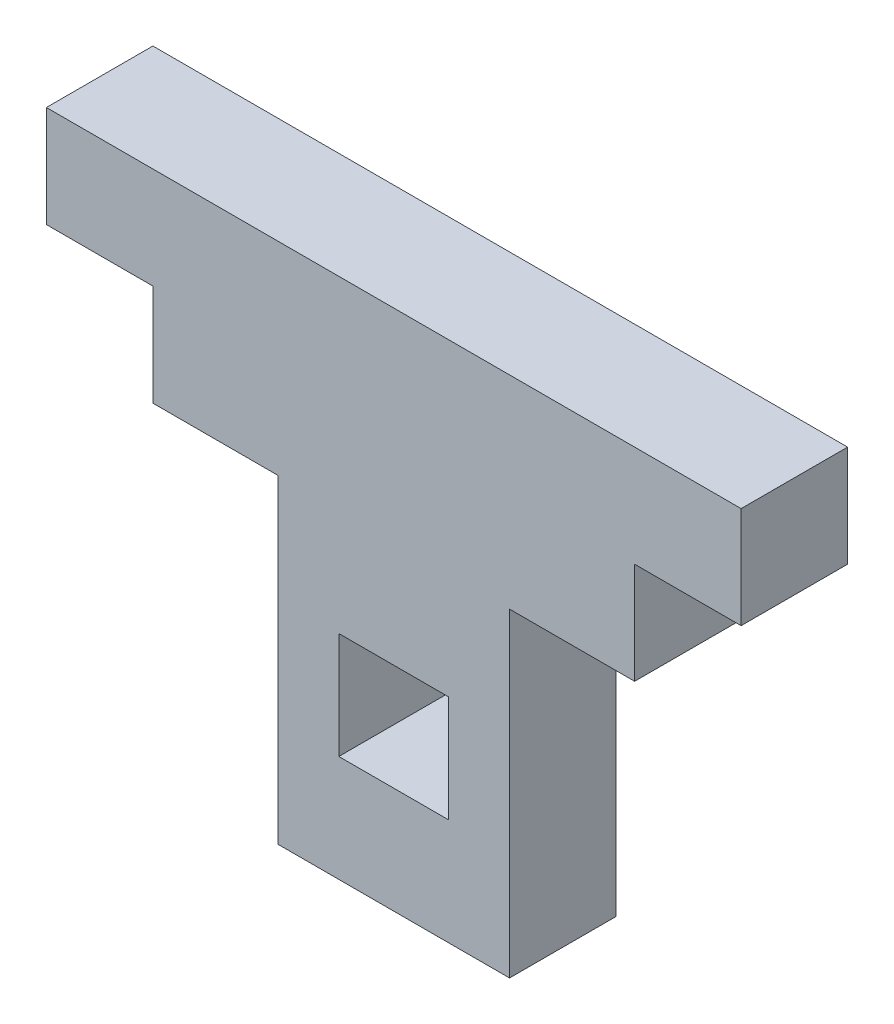
ISO-10303-21;
HEADER;
FILE_DESCRIPTION(('STEP AP214'),'2;1');
FILE_NAME('part.step','',(''),(''),'','','');
FILE_SCHEMA(('AUTOMOTIVE_DESIGN { 1 0 10303 214 1 1 1 1 }'));
ENDSEC;
DATA;
#1=APPLICATION_CONTEXT('core data for automotive mechanical design processes');
#2=APPLICATION_PROTOCOL_DEFINITION('international standard','automotive_design',2000,#1);
#3=PRODUCT_CONTEXT('',#1,'mechanical');
#4=PRODUCT('Part','Part','',(#3));
#5=PRODUCT_RELATED_PRODUCT_CATEGORY('part','',(#4));
#6=PRODUCT_DEFINITION_FORMATION('','',#4);
#7=PRODUCT_DEFINITION_CONTEXT('part definition',#1,'design');
#8=PRODUCT_DEFINITION('design','',#6,#7);
#9=PRODUCT_DEFINITION_SHAPE('','',#8);
#10=(LENGTH_UNIT() NAMED_UNIT(*) SI_UNIT(.MILLI.,.METRE.));
#11=(NAMED_UNIT(*) PLANE_ANGLE_UNIT() SI_UNIT($,.RADIAN.));
#12=(NAMED_UNIT(*) SI_UNIT($,.STERADIAN.) SOLID_ANGLE_UNIT());
#13=UNCERTAINTY_MEASURE_WITH_UNIT(LENGTH_MEASURE(1.E-05),#10,'distance_accuracy_value','');
#14=(GEOMETRIC_REPRESENTATION_CONTEXT(3) GLOBAL_UNCERTAINTY_ASSIGNED_CONTEXT((#13)) GLOBAL_UNIT_ASSIGNED_CONTEXT((#10,
#11,#12)) REPRESENTATION_CONTEXT('',''));
#15=CARTESIAN_POINT('',(0.,0.,0.));
#16=DIRECTION('',(0.,0.,1.));
#17=DIRECTION('',(1.,0.,0.));
#18=AXIS2_PLACEMENT_3D('',#15,#16,#17);
#19=CARTESIAN_POINT('',(0.,0.,0.));
#20=DIRECTION('',(0.,1.,0.));
#21=DIRECTION('',(0.,0.,1.));
#22=AXIS2_PLACEMENT_3D('',#19,#20,#21);
#23=PLANE('',#22);
#24=DIRECTION('',(0.,0.,1.));
#25=VECTOR('',#24,1.);
#26=CARTESIAN_POINT('',(0.,0.,5.334));
#27=LINE('',#26,#25);
#28=CARTESIAN_POINT('',(0.,0.,0.));
#29=VERTEX_POINT('',#28);
#30=CARTESIAN_POINT('',(0.,0.,5.334));
#31=VERTEX_POINT('',#30);
#32=EDGE_CURVE('E216',#29,#31,#27,.T.);
#33=ORIENTED_EDGE('',*,*,#32,.F.);
#34=DIRECTION('',(1.,0.,0.));
#35=VECTOR('',#34,1.);
#36=CARTESIAN_POINT('',(-5.334,0.,0.));
#37=LINE('',#36,#35);
#38=CARTESIAN_POINT('',(6.26533333333333,0.,0.));
#39=VERTEX_POINT('',#38);
#40=EDGE_CURVE('E178',#29,#39,#37,.T.);
#41=ORIENTED_EDGE('',*,*,#40,.T.);
#42=DIRECTION('',(0.,0.,1.));
#43=VECTOR('',#42,1.);
#44=CARTESIAN_POINT('',(6.26533333333333,0.,0.));
#45=LINE('',#44,#43);
#46=CARTESIAN_POINT('',(6.26533333333333,0.,5.334));
#47=VERTEX_POINT('',#46);
#48=EDGE_CURVE('E269',#39,#47,#45,.T.);
#49=ORIENTED_EDGE('',*,*,#48,.T.);
#50=DIRECTION('',(-1.,0.,0.));
#51=VECTOR('',#50,1.);
#52=CARTESIAN_POINT('',(-5.334,0.,5.334));
#53=LINE('',#52,#51);
#54=EDGE_CURVE('E272',#47,#31,#53,.T.);
#55=ORIENTED_EDGE('',*,*,#54,.T.);
#56=EDGE_LOOP('',(#33,#41,#49,#55));
#57=FACE_BOUND('',#56,.T.);
#58=ADVANCED_FACE('F35',(#57),#23,.F.);
#59=CARTESIAN_POINT('',(29.464,0.,0.));
#60=DIRECTION('',(1.,0.,0.));
#61=DIRECTION('',(0.,1.,0.));
#62=AXIS2_PLACEMENT_3D('',#59,#60,#61);
#63=PLANE('',#62);
#64=DIRECTION('',(0.,0.,1.));
#65=VECTOR('',#64,1.);
#66=CARTESIAN_POINT('',(29.464,5.08000000000001,5.334));
#67=LINE('',#66,#65);
#68=CARTESIAN_POINT('',(29.464,5.08000000000001,0.));
#69=VERTEX_POINT('',#68);
#70=CARTESIAN_POINT('',(29.464,5.08000000000001,5.334));
#71=VERTEX_POINT('',#70);
#72=EDGE_CURVE('E306',#69,#71,#67,.T.);
#73=ORIENTED_EDGE('',*,*,#72,.F.);
#74=DIRECTION('',(0.,1.,0.));
#75=VECTOR('',#74,1.);
#76=CARTESIAN_POINT('',(29.464,10.16,0.));
#77=LINE('',#76,#75);
#78=CARTESIAN_POINT('',(29.464,10.16,0.));
#79=VERTEX_POINT('',#78);
#80=EDGE_CURVE('E189',#69,#79,#77,.T.);
#81=ORIENTED_EDGE('',*,*,#80,.T.);
#82=DIRECTION('',(0.,0.,1.));
#83=VECTOR('',#82,1.);
#84=CARTESIAN_POINT('',(29.464,10.16,5.334));
#85=LINE('',#84,#83);
#86=CARTESIAN_POINT('',(29.464,10.16,5.334));
#87=VERTEX_POINT('',#86);
#88=EDGE_CURVE('E200',#79,#87,#85,.T.);
#89=ORIENTED_EDGE('',*,*,#88,.T.);
#90=DIRECTION('',(0.,-1.,0.));
#91=VECTOR('',#90,1.);
#92=CARTESIAN_POINT('',(29.464,10.16,5.334));
#93=LINE('',#92,#91);
#94=EDGE_CURVE('E186',#87,#71,#93,.T.);
#95=ORIENTED_EDGE('',*,*,#94,.T.);
#96=EDGE_LOOP('',(#73,#81,#89,#95));
#97=FACE_BOUND('',#96,.T.);
#98=ADVANCED_FACE('F305',(#97),#63,.T.);
#99=CARTESIAN_POINT('',(0.,10.16,5.334));
#100=DIRECTION('',(0.,1.,0.));
#101=DIRECTION('',(0.,0.,1.));
#102=AXIS2_PLACEMENT_3D('',#99,#100,#101);
#103=PLANE('',#102);
#104=DIRECTION('',(1.,0.,0.));
#105=VECTOR('',#104,1.);
#106=CARTESIAN_POINT('',(0.,10.16,0.));
#107=LINE('',#106,#105);
#108=CARTESIAN_POINT('',(-5.33400000000001,10.16,0.));
#109=VERTEX_POINT('',#108);
#110=EDGE_CURVE('E39',#109,#79,#107,.T.);
#111=ORIENTED_EDGE('',*,*,#110,.F.);
#112=DIRECTION('',(0.,0.,-1.));
#113=VECTOR('',#112,1.);
#114=CARTESIAN_POINT('',(-5.33400000000001,10.16,0.));
#115=LINE('',#114,#113);
#116=CARTESIAN_POINT('',(-5.33400000000001,10.16,5.334));
#117=VERTEX_POINT('',#116);
#118=EDGE_CURVE('E221',#117,#109,#115,.T.);
#119=ORIENTED_EDGE('',*,*,#118,.F.);
#120=DIRECTION('',(1.,0.,0.));
#121=VECTOR('',#120,1.);
#122=CARTESIAN_POINT('',(0.,10.16,5.334));
#123=LINE('',#122,#121);
#124=EDGE_CURVE('E11',#117,#87,#123,.T.);
#125=ORIENTED_EDGE('',*,*,#124,.T.);
#126=ORIENTED_EDGE('',*,*,#88,.F.);
#127=EDGE_LOOP('',(#111,#119,#125,#126));
#128=FACE_BOUND('',#127,.T.);
#129=ADVANCED_FACE('F37',(#128),#103,.T.);
#130=CARTESIAN_POINT('',(0.,0.,5.334));
#131=DIRECTION('',(0.,0.,1.));
#132=DIRECTION('',(1.,0.,0.));
#133=AXIS2_PLACEMENT_3D('',#130,#131,#132);
#134=PLANE('',#133);
#135=DIRECTION('',(1.,0.,0.));
#136=VECTOR('',#135,1.);
#137=CARTESIAN_POINT('',(24.13,5.08000000000001,5.334));
#138=LINE('',#137,#136);
#139=CARTESIAN_POINT('',(24.13,5.08000000000001,5.334));
#140=VERTEX_POINT('',#139);
#141=EDGE_CURVE('E203',#140,#71,#138,.T.);
#142=ORIENTED_EDGE('',*,*,#141,.T.);
#143=ORIENTED_EDGE('',*,*,#94,.F.);
#144=ORIENTED_EDGE('',*,*,#124,.F.);
#145=DIRECTION('',(0.,1.,0.));
#146=VECTOR('',#145,1.);
#147=CARTESIAN_POINT('',(-5.334,10.2062061145485,5.334));
#148=LINE('',#147,#146);
#149=CARTESIAN_POINT('',(-5.334,5.08,5.334));
#150=VERTEX_POINT('',#149);
#151=EDGE_CURVE('E183',#150,#117,#148,.T.);
#152=ORIENTED_EDGE('',*,*,#151,.F.);
#153=DIRECTION('',(-1.,0.,0.));
#154=VECTOR('',#153,1.);
#155=CARTESIAN_POINT('',(0.,5.08,5.334));
#156=LINE('',#155,#154);
#157=CARTESIAN_POINT('',(0.,5.08,5.334));
#158=VERTEX_POINT('',#157);
#159=EDGE_CURVE('E217',#158,#150,#156,.T.);
#160=ORIENTED_EDGE('',*,*,#159,.F.);
#161=DIRECTION('',(0.,1.,0.));
#162=VECTOR('',#161,1.);
#163=CARTESIAN_POINT('',(0.,0.,5.334));
#164=LINE('',#163,#162);
#165=EDGE_CURVE('E205',#31,#158,#164,.T.);
#166=ORIENTED_EDGE('',*,*,#165,.F.);
#167=ORIENTED_EDGE('',*,*,#54,.F.);
#168=DIRECTION('',(0.,-1.,0.));
#169=VECTOR('',#168,1.);
#170=CARTESIAN_POINT('',(6.26533333333333,0.,5.334));
#171=LINE('',#170,#169);
#172=CARTESIAN_POINT('',(6.26533333333333,-16.002,5.334));
#173=VERTEX_POINT('',#172);
#174=EDGE_CURVE('E184',#47,#173,#171,.T.);
#175=ORIENTED_EDGE('',*,*,#174,.T.);
#176=DIRECTION('',(-1.,0.,0.));
#177=VECTOR('',#176,1.);
#178=CARTESIAN_POINT('',(6.26533333333333,-16.002,5.334));
#179=LINE('',#178,#177);
#180=CARTESIAN_POINT('',(17.8646666666667,-16.002,5.334));
#181=VERTEX_POINT('',#180);
#182=EDGE_CURVE('E265',#181,#173,#179,.T.);
#183=ORIENTED_EDGE('',*,*,#182,.F.);
#184=DIRECTION('',(0.,-1.,0.));
#185=VECTOR('',#184,1.);
#186=CARTESIAN_POINT('',(17.8646666666667,0.,5.334));
#187=LINE('',#186,#185);
#188=CARTESIAN_POINT('',(17.8646666666667,0.,5.334));
#189=VERTEX_POINT('',#188);
#190=EDGE_CURVE('E170',#189,#181,#187,.T.);
#191=ORIENTED_EDGE('',*,*,#190,.F.);
#192=DIRECTION('',(-1.,0.,0.));
#193=VECTOR('',#192,1.);
#194=CARTESIAN_POINT('',(29.464,0.,5.334));
#195=LINE('',#194,#193);
#196=CARTESIAN_POINT('',(24.13,0.,5.334));
#197=VERTEX_POINT('',#196);
#198=EDGE_CURVE('E174',#197,#189,#195,.T.);
#199=ORIENTED_EDGE('',*,*,#198,.F.);
#200=DIRECTION('',(0.,-1.,0.));
#201=VECTOR('',#200,1.);
#202=CARTESIAN_POINT('',(24.13,0.,5.334));
#203=LINE('',#202,#201);
#204=EDGE_CURVE('E50',#140,#197,#203,.T.);
#205=ORIENTED_EDGE('',*,*,#204,.F.);
#206=EDGE_LOOP('',(#142,#143,#144,#152,#160,#166,#167,#175,#183,#191,#199,#205));
#207=FACE_BOUND('',#206,.T.);
#208=DIRECTION('',(0.,-1.,0.));
#209=VECTOR('',#208,1.);
#210=CARTESIAN_POINT('',(9.31333333333333,-5.334,5.334));
#211=LINE('',#210,#209);
#212=CARTESIAN_POINT('',(9.31333333333333,-5.334,5.334));
#213=VERTEX_POINT('',#212);
#214=CARTESIAN_POINT('',(9.31333333333333,-10.668,5.334));
#215=VERTEX_POINT('',#214);
#216=EDGE_CURVE('E224',#213,#215,#211,.T.);
#217=ORIENTED_EDGE('',*,*,#216,.F.);
#218=DIRECTION('',(-1.,0.,0.));
#219=VECTOR('',#218,1.);
#220=CARTESIAN_POINT('',(9.31333333333333,-5.334,5.334));
#221=LINE('',#220,#219);
#222=CARTESIAN_POINT('',(14.8166666666667,-5.334,5.334));
#223=VERTEX_POINT('',#222);
#224=EDGE_CURVE('E229',#223,#213,#221,.T.);
#225=ORIENTED_EDGE('',*,*,#224,.F.);
#226=DIRECTION('',(0.,1.,0.));
#227=VECTOR('',#226,1.);
#228=CARTESIAN_POINT('',(14.8166666666667,-5.334,5.334));
#229=LINE('',#228,#227);
#230=CARTESIAN_POINT('',(14.8166666666667,-10.668,5.334));
#231=VERTEX_POINT('',#230);
#232=EDGE_CURVE('E243',#231,#223,#229,.T.);
#233=ORIENTED_EDGE('',*,*,#232,.F.);
#234=DIRECTION('',(1.,0.,0.));
#235=VECTOR('',#234,1.);
#236=CARTESIAN_POINT('',(9.31333333333333,-10.668,5.334));
#237=LINE('',#236,#235);
#238=EDGE_CURVE('E240',#215,#231,#237,.T.);
#239=ORIENTED_EDGE('',*,*,#238,.F.);
#240=EDGE_LOOP('',(#217,#225,#233,#239));
#241=FACE_BOUND('',#240,.T.);
#242=ADVANCED_FACE('F283',(#207,#241),#134,.T.);
#243=CARTESIAN_POINT('',(0.,0.,0.));
#244=DIRECTION('',(0.,0.,1.));
#245=DIRECTION('',(1.,0.,0.));
#246=AXIS2_PLACEMENT_3D('',#243,#244,#245);
#247=PLANE('',#246);
#248=ORIENTED_EDGE('',*,*,#80,.F.);
#249=DIRECTION('',(1.,0.,0.));
#250=VECTOR('',#249,1.);
#251=CARTESIAN_POINT('',(24.13,5.08000000000001,0.));
#252=LINE('',#251,#250);
#253=CARTESIAN_POINT('',(24.13,5.08000000000001,0.));
#254=VERTEX_POINT('',#253);
#255=EDGE_CURVE('E163',#254,#69,#252,.T.);
#256=ORIENTED_EDGE('',*,*,#255,.F.);
#257=DIRECTION('',(0.,1.,0.));
#258=VECTOR('',#257,1.);
#259=CARTESIAN_POINT('',(24.13,0.,0.));
#260=LINE('',#259,#258);
#261=CARTESIAN_POINT('',(24.13,0.,0.));
#262=VERTEX_POINT('',#261);
#263=EDGE_CURVE('E150',#262,#254,#260,.T.);
#264=ORIENTED_EDGE('',*,*,#263,.F.);
#265=DIRECTION('',(1.,0.,0.));
#266=VECTOR('',#265,1.);
#267=CARTESIAN_POINT('',(29.464,0.,0.));
#268=LINE('',#267,#266);
#269=CARTESIAN_POINT('',(17.8646666666667,0.,0.));
#270=VERTEX_POINT('',#269);
#271=EDGE_CURVE('E162',#270,#262,#268,.T.);
#272=ORIENTED_EDGE('',*,*,#271,.F.);
#273=DIRECTION('',(0.,-1.,0.));
#274=VECTOR('',#273,1.);
#275=CARTESIAN_POINT('',(17.8646666666667,0.,0.));
#276=LINE('',#275,#274);
#277=CARTESIAN_POINT('',(17.8646666666667,-16.002,0.));
#278=VERTEX_POINT('',#277);
#279=EDGE_CURVE('E172',#270,#278,#276,.T.);
#280=ORIENTED_EDGE('',*,*,#279,.T.);
#281=DIRECTION('',(1.,0.,0.));
#282=VECTOR('',#281,1.);
#283=CARTESIAN_POINT('',(6.26533333333333,-16.002,0.));
#284=LINE('',#283,#282);
#285=CARTESIAN_POINT('',(6.26533333333333,-16.002,0.));
#286=VERTEX_POINT('',#285);
#287=EDGE_CURVE('E259',#286,#278,#284,.T.);
#288=ORIENTED_EDGE('',*,*,#287,.F.);
#289=DIRECTION('',(0.,-1.,0.));
#290=VECTOR('',#289,1.);
#291=CARTESIAN_POINT('',(6.26533333333333,0.,0.));
#292=LINE('',#291,#290);
#293=EDGE_CURVE('E275',#39,#286,#292,.T.);
#294=ORIENTED_EDGE('',*,*,#293,.F.);
#295=ORIENTED_EDGE('',*,*,#40,.F.);
#296=DIRECTION('',(0.,-1.,0.));
#297=VECTOR('',#296,1.);
#298=CARTESIAN_POINT('',(0.,0.,0.));
#299=LINE('',#298,#297);
#300=CARTESIAN_POINT('',(0.,5.08,0.));
#301=VERTEX_POINT('',#300);
#302=EDGE_CURVE('E58',#301,#29,#299,.T.);
#303=ORIENTED_EDGE('',*,*,#302,.F.);
#304=DIRECTION('',(-1.,0.,0.));
#305=VECTOR('',#304,1.);
#306=CARTESIAN_POINT('',(0.,5.08,0.));
#307=LINE('',#306,#305);
#308=CARTESIAN_POINT('',(-5.334,5.08,0.));
#309=VERTEX_POINT('',#308);
#310=EDGE_CURVE('E219',#301,#309,#307,.T.);
#311=ORIENTED_EDGE('',*,*,#310,.T.);
#312=DIRECTION('',(0.,-1.,0.));
#313=VECTOR('',#312,1.);
#314=CARTESIAN_POINT('',(-5.334,10.2062061145485,0.));
#315=LINE('',#314,#313);
#316=EDGE_CURVE('E180',#109,#309,#315,.T.);
#317=ORIENTED_EDGE('',*,*,#316,.F.);
#318=ORIENTED_EDGE('',*,*,#110,.T.);
#319=EDGE_LOOP('',(#248,#256,#264,#272,#280,#288,#294,#295,#303,#311,#317,#318));
#320=FACE_BOUND('',#319,.T.);
#321=DIRECTION('',(-1.,0.,0.));
#322=VECTOR('',#321,1.);
#323=CARTESIAN_POINT('',(9.31333333333333,-5.334,0.));
#324=LINE('',#323,#322);
#325=CARTESIAN_POINT('',(14.8166666666667,-5.334,0.));
#326=VERTEX_POINT('',#325);
#327=CARTESIAN_POINT('',(9.31333333333333,-5.334,0.));
#328=VERTEX_POINT('',#327);
#329=EDGE_CURVE('E235',#326,#328,#324,.T.);
#330=ORIENTED_EDGE('',*,*,#329,.T.);
#331=DIRECTION('',(0.,-1.,0.));
#332=VECTOR('',#331,1.);
#333=CARTESIAN_POINT('',(9.31333333333333,-5.334,0.));
#334=LINE('',#333,#332);
#335=CARTESIAN_POINT('',(9.31333333333333,-10.668,0.));
#336=VERTEX_POINT('',#335);
#337=EDGE_CURVE('E225',#328,#336,#334,.T.);
#338=ORIENTED_EDGE('',*,*,#337,.T.);
#339=DIRECTION('',(1.,0.,0.));
#340=VECTOR('',#339,1.);
#341=CARTESIAN_POINT('',(9.31333333333333,-10.668,0.));
#342=LINE('',#341,#340);
#343=CARTESIAN_POINT('',(14.8166666666667,-10.668,0.));
#344=VERTEX_POINT('',#343);
#345=EDGE_CURVE('E228',#336,#344,#342,.T.);
#346=ORIENTED_EDGE('',*,*,#345,.T.);
#347=DIRECTION('',(0.,1.,0.));
#348=VECTOR('',#347,1.);
#349=CARTESIAN_POINT('',(14.8166666666667,-5.334,0.));
#350=LINE('',#349,#348);
#351=EDGE_CURVE('E232',#344,#326,#350,.T.);
#352=ORIENTED_EDGE('',*,*,#351,.T.);
#353=EDGE_LOOP('',(#330,#338,#346,#352));
#354=FACE_BOUND('',#353,.T.);
#355=ADVANCED_FACE('F160',(#320,#354),#247,.F.);
#356=CARTESIAN_POINT('',(-5.334,0.,0.));
#357=DIRECTION('',(-1.,0.,0.));
#358=DIRECTION('',(0.,-1.,0.));
#359=AXIS2_PLACEMENT_3D('',#356,#357,#358);
#360=PLANE('',#359);
#361=DIRECTION('',(0.,0.,-1.));
#362=VECTOR('',#361,1.);
#363=CARTESIAN_POINT('',(-5.334,5.08,5.334));
#364=LINE('',#363,#362);
#365=EDGE_CURVE('E202',#150,#309,#364,.T.);
#366=ORIENTED_EDGE('',*,*,#365,.F.);
#367=ORIENTED_EDGE('',*,*,#151,.T.);
#368=ORIENTED_EDGE('',*,*,#118,.T.);
#369=ORIENTED_EDGE('',*,*,#316,.T.);
#370=EDGE_LOOP('',(#366,#367,#368,#369));
#371=FACE_BOUND('',#370,.T.);
#372=ADVANCED_FACE('F304',(#371),#360,.T.);
#373=CARTESIAN_POINT('',(17.8646666666667,0.,0.));
#374=DIRECTION('',(-1.,0.,0.));
#375=DIRECTION('',(0.,0.,1.));
#376=AXIS2_PLACEMENT_3D('',#373,#374,#375);
#377=PLANE('',#376);
#378=ORIENTED_EDGE('',*,*,#190,.T.);
#379=DIRECTION('',(0.,0.,1.));
#380=VECTOR('',#379,1.);
#381=CARTESIAN_POINT('',(17.8646666666667,-16.002,5.334));
#382=LINE('',#381,#380);
#383=EDGE_CURVE('E262',#278,#181,#382,.T.);
#384=ORIENTED_EDGE('',*,*,#383,.F.);
#385=ORIENTED_EDGE('',*,*,#279,.F.);
#386=DIRECTION('',(0.,0.,-1.));
#387=VECTOR('',#386,1.);
#388=CARTESIAN_POINT('',(17.8646666666667,0.,0.));
#389=LINE('',#388,#387);
#390=EDGE_CURVE('E169',#189,#270,#389,.T.);
#391=ORIENTED_EDGE('',*,*,#390,.F.);
#392=EDGE_LOOP('',(#378,#384,#385,#391));
#393=FACE_BOUND('',#392,.T.);
#394=ADVANCED_FACE('F280',(#393),#377,.F.);
#395=CARTESIAN_POINT('',(0.,0.,0.));
#396=DIRECTION('',(0.,-1.,0.));
#397=DIRECTION('',(0.,0.,-1.));
#398=AXIS2_PLACEMENT_3D('',#395,#396,#397);
#399=PLANE('',#398);
#400=DIRECTION('',(0.,0.,-1.));
#401=VECTOR('',#400,1.);
#402=CARTESIAN_POINT('',(24.13,0.,5.334));
#403=LINE('',#402,#401);
#404=EDGE_CURVE('E147',#197,#262,#403,.T.);
#405=ORIENTED_EDGE('',*,*,#404,.F.);
#406=ORIENTED_EDGE('',*,*,#198,.T.);
#407=ORIENTED_EDGE('',*,*,#390,.T.);
#408=ORIENTED_EDGE('',*,*,#271,.T.);
#409=EDGE_LOOP('',(#405,#406,#407,#408));
#410=FACE_BOUND('',#409,.T.);
#411=ADVANCED_FACE('F167',(#410),#399,.T.);
#412=CARTESIAN_POINT('',(6.26533333333333,0.,0.));
#413=DIRECTION('',(1.,0.,0.));
#414=DIRECTION('',(0.,0.,-1.));
#415=AXIS2_PLACEMENT_3D('',#412,#413,#414);
#416=PLANE('',#415);
#417=ORIENTED_EDGE('',*,*,#293,.T.);
#418=DIRECTION('',(0.,0.,-1.));
#419=VECTOR('',#418,1.);
#420=CARTESIAN_POINT('',(6.26533333333333,-16.002,5.334));
#421=LINE('',#420,#419);
#422=EDGE_CURVE('E250',#173,#286,#421,.T.);
#423=ORIENTED_EDGE('',*,*,#422,.F.);
#424=ORIENTED_EDGE('',*,*,#174,.F.);
#425=ORIENTED_EDGE('',*,*,#48,.F.);
#426=EDGE_LOOP('',(#417,#423,#424,#425));
#427=FACE_BOUND('',#426,.T.);
#428=ADVANCED_FACE('F290',(#427),#416,.F.);
#429=CARTESIAN_POINT('',(0.,-16.002,0.));
#430=DIRECTION('',(0.,-1.,0.));
#431=DIRECTION('',(0.,0.,-1.));
#432=AXIS2_PLACEMENT_3D('',#429,#430,#431);
#433=PLANE('',#432);
#434=ORIENTED_EDGE('',*,*,#422,.T.);
#435=ORIENTED_EDGE('',*,*,#287,.T.);
#436=ORIENTED_EDGE('',*,*,#383,.T.);
#437=ORIENTED_EDGE('',*,*,#182,.T.);
#438=EDGE_LOOP('',(#434,#435,#436,#437));
#439=FACE_BOUND('',#438,.T.);
#440=ADVANCED_FACE('F288',(#439),#433,.T.);
#441=CARTESIAN_POINT('',(9.31333333333333,-5.334,0.));
#442=DIRECTION('',(-1.,0.,0.));
#443=DIRECTION('',(0.,0.,1.));
#444=AXIS2_PLACEMENT_3D('',#441,#442,#443);
#445=PLANE('',#444);
#446=ORIENTED_EDGE('',*,*,#216,.T.);
#447=DIRECTION('',(0.,0.,1.));
#448=VECTOR('',#447,1.);
#449=CARTESIAN_POINT('',(9.31333333333333,-10.668,0.));
#450=LINE('',#449,#448);
#451=EDGE_CURVE('E238',#336,#215,#450,.T.);
#452=ORIENTED_EDGE('',*,*,#451,.F.);
#453=ORIENTED_EDGE('',*,*,#337,.F.);
#454=DIRECTION('',(0.,0.,1.));
#455=VECTOR('',#454,1.);
#456=CARTESIAN_POINT('',(9.31333333333333,-5.334,0.));
#457=LINE('',#456,#455);
#458=EDGE_CURVE('E248',#328,#213,#457,.T.);
#459=ORIENTED_EDGE('',*,*,#458,.T.);
#460=EDGE_LOOP('',(#446,#452,#453,#459));
#461=FACE_BOUND('',#460,.T.);
#462=ADVANCED_FACE('F395',(#461),#445,.F.);
#463=CARTESIAN_POINT('',(9.31333333333333,-5.334,0.));
#464=DIRECTION('',(0.,1.,0.));
#465=DIRECTION('',(0.,0.,1.));
#466=AXIS2_PLACEMENT_3D('',#463,#464,#465);
#467=PLANE('',#466);
#468=ORIENTED_EDGE('',*,*,#224,.T.);
#469=ORIENTED_EDGE('',*,*,#458,.F.);
#470=ORIENTED_EDGE('',*,*,#329,.F.);
#471=DIRECTION('',(0.,0.,1.));
#472=VECTOR('',#471,1.);
#473=CARTESIAN_POINT('',(14.8166666666667,-5.334,0.));
#474=LINE('',#473,#472);
#475=EDGE_CURVE('E251',#326,#223,#474,.T.);
#476=ORIENTED_EDGE('',*,*,#475,.T.);
#477=EDGE_LOOP('',(#468,#469,#470,#476));
#478=FACE_BOUND('',#477,.T.);
#479=ADVANCED_FACE('F387',(#478),#467,.F.);
#480=CARTESIAN_POINT('',(14.8166666666667,-5.334,0.));
#481=DIRECTION('',(1.,0.,0.));
#482=DIRECTION('',(0.,0.,-1.));
#483=AXIS2_PLACEMENT_3D('',#480,#481,#482);
#484=PLANE('',#483);
#485=ORIENTED_EDGE('',*,*,#232,.T.);
#486=ORIENTED_EDGE('',*,*,#475,.F.);
#487=ORIENTED_EDGE('',*,*,#351,.F.);
#488=DIRECTION('',(0.,0.,1.));
#489=VECTOR('',#488,1.);
#490=CARTESIAN_POINT('',(14.8166666666667,-10.668,0.));
#491=LINE('',#490,#489);
#492=EDGE_CURVE('E253',#344,#231,#491,.T.);
#493=ORIENTED_EDGE('',*,*,#492,.T.);
#494=EDGE_LOOP('',(#485,#486,#487,#493));
#495=FACE_BOUND('',#494,.T.);
#496=ADVANCED_FACE('F379',(#495),#484,.F.);
#497=CARTESIAN_POINT('',(9.31333333333333,-10.668,0.));
#498=DIRECTION('',(0.,-1.,0.));
#499=DIRECTION('',(0.,0.,-1.));
#500=AXIS2_PLACEMENT_3D('',#497,#498,#499);
#501=PLANE('',#500);
#502=ORIENTED_EDGE('',*,*,#238,.T.);
#503=ORIENTED_EDGE('',*,*,#492,.F.);
#504=ORIENTED_EDGE('',*,*,#345,.F.);
#505=ORIENTED_EDGE('',*,*,#451,.T.);
#506=EDGE_LOOP('',(#502,#503,#504,#505));
#507=FACE_BOUND('',#506,.T.);
#508=ADVANCED_FACE('F365',(#507),#501,.F.);
#509=CARTESIAN_POINT('',(0.,5.08,5.334));
#510=DIRECTION('',(0.,1.,0.));
#511=DIRECTION('',(-1.,0.,0.));
#512=AXIS2_PLACEMENT_3D('',#509,#510,#511);
#513=PLANE('',#512);
#514=ORIENTED_EDGE('',*,*,#365,.T.);
#515=ORIENTED_EDGE('',*,*,#310,.F.);
#516=DIRECTION('',(0.,0.,-1.));
#517=VECTOR('',#516,1.);
#518=CARTESIAN_POINT('',(0.,5.08,5.334));
#519=LINE('',#518,#517);
#520=EDGE_CURVE('E213',#158,#301,#519,.T.);
#521=ORIENTED_EDGE('',*,*,#520,.F.);
#522=ORIENTED_EDGE('',*,*,#159,.T.);
#523=EDGE_LOOP('',(#514,#515,#521,#522));
#524=FACE_BOUND('',#523,.T.);
#525=ADVANCED_FACE('F302',(#524),#513,.F.);
#526=CARTESIAN_POINT('',(0.,0.,0.));
#527=DIRECTION('',(-1.,0.,0.));
#528=DIRECTION('',(0.,-1.,0.));
#529=AXIS2_PLACEMENT_3D('',#526,#527,#528);
#530=PLANE('',#529);
#531=ORIENTED_EDGE('',*,*,#165,.T.);
#532=ORIENTED_EDGE('',*,*,#520,.T.);
#533=ORIENTED_EDGE('',*,*,#302,.T.);
#534=ORIENTED_EDGE('',*,*,#32,.T.);
#535=EDGE_LOOP('',(#531,#532,#533,#534));
#536=FACE_BOUND('',#535,.T.);
#537=ADVANCED_FACE('F297',(#536),#530,.T.);
#538=CARTESIAN_POINT('',(24.13,5.08000000000001,5.334));
#539=DIRECTION('',(0.,1.,0.));
#540=DIRECTION('',(-1.,0.,0.));
#541=AXIS2_PLACEMENT_3D('',#538,#539,#540);
#542=PLANE('',#541);
#543=ORIENTED_EDGE('',*,*,#72,.T.);
#544=ORIENTED_EDGE('',*,*,#141,.F.);
#545=DIRECTION('',(0.,0.,1.));
#546=VECTOR('',#545,1.);
#547=CARTESIAN_POINT('',(24.13,5.08000000000001,5.334));
#548=LINE('',#547,#546);
#549=EDGE_CURVE('E164',#254,#140,#548,.T.);
#550=ORIENTED_EDGE('',*,*,#549,.F.);
#551=ORIENTED_EDGE('',*,*,#255,.T.);
#552=EDGE_LOOP('',(#543,#544,#550,#551));
#553=FACE_BOUND('',#552,.T.);
#554=ADVANCED_FACE('F311',(#553),#542,.F.);
#555=CARTESIAN_POINT('',(24.13,0.,0.));
#556=DIRECTION('',(-1.,0.,0.));
#557=DIRECTION('',(0.,0.,1.));
#558=AXIS2_PLACEMENT_3D('',#555,#556,#557);
#559=PLANE('',#558);
#560=ORIENTED_EDGE('',*,*,#204,.T.);
#561=ORIENTED_EDGE('',*,*,#404,.T.);
#562=ORIENTED_EDGE('',*,*,#263,.T.);
#563=ORIENTED_EDGE('',*,*,#549,.T.);
#564=EDGE_LOOP('',(#560,#561,#562,#563));
#565=FACE_BOUND('',#564,.T.);
#566=ADVANCED_FACE('F149',(#565),#559,.F.);
#567=CLOSED_SHELL('',(#58,#98,#129,#242,#355,#372,#394,#411,#428,#440,#462,#479,#496,#508,#525,
#537,#554,#566));
#568=MANIFOLD_SOLID_BREP('B2',#567);
#569=ADVANCED_BREP_SHAPE_REPRESENTATION('',(#18,#568),#14);
#570=SHAPE_DEFINITION_REPRESENTATION(#9,#569);
ENDSEC;
END-ISO-10303-21;
